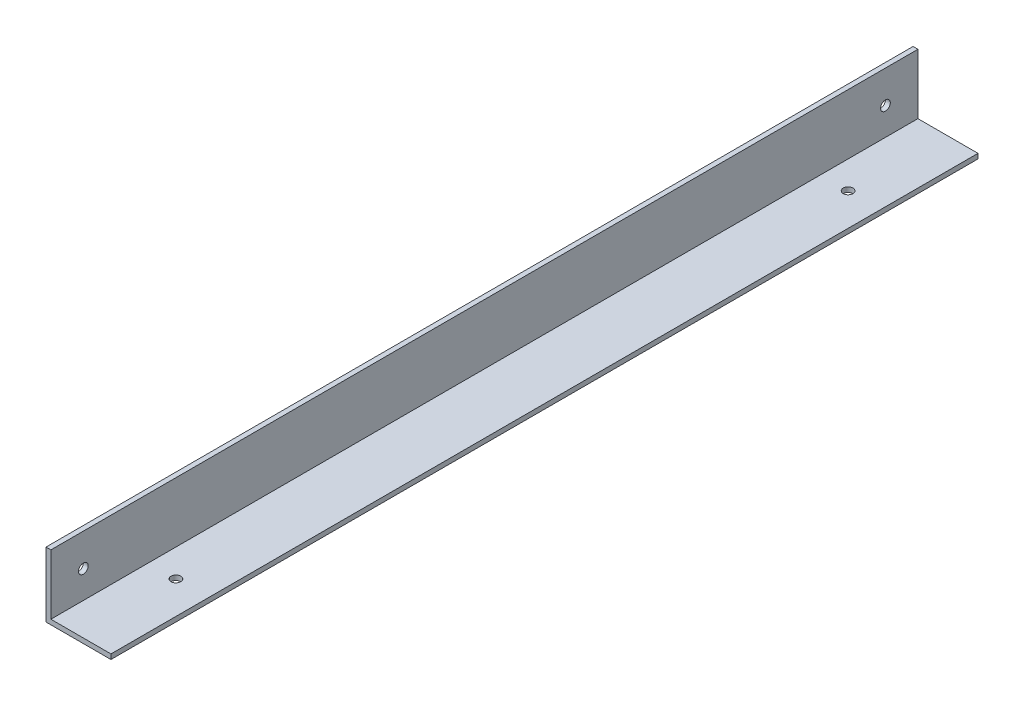
ISO-10303-21;
HEADER;
FILE_DESCRIPTION(('STEP AP214'),'2;1');
FILE_NAME('part.step','',(''),(''),'','','');
FILE_SCHEMA(('AUTOMOTIVE_DESIGN { 1 0 10303 214 1 1 1 1 }'));
ENDSEC;
DATA;
#1=APPLICATION_CONTEXT('core data for automotive mechanical design processes');
#2=APPLICATION_PROTOCOL_DEFINITION('international standard','automotive_design',2000,#1);
#3=PRODUCT_CONTEXT('',#1,'mechanical');
#4=PRODUCT('Part','Part','',(#3));
#5=PRODUCT_RELATED_PRODUCT_CATEGORY('part','',(#4));
#6=PRODUCT_DEFINITION_FORMATION('','',#4);
#7=PRODUCT_DEFINITION_CONTEXT('part definition',#1,'design');
#8=PRODUCT_DEFINITION('design','',#6,#7);
#9=PRODUCT_DEFINITION_SHAPE('','',#8);
#10=(LENGTH_UNIT() NAMED_UNIT(*) SI_UNIT(.MILLI.,.METRE.));
#11=(NAMED_UNIT(*) PLANE_ANGLE_UNIT() SI_UNIT($,.RADIAN.));
#12=(NAMED_UNIT(*) SI_UNIT($,.STERADIAN.) SOLID_ANGLE_UNIT());
#13=UNCERTAINTY_MEASURE_WITH_UNIT(LENGTH_MEASURE(1.E-05),#10,'distance_accuracy_value','');
#14=(GEOMETRIC_REPRESENTATION_CONTEXT(3) GLOBAL_UNCERTAINTY_ASSIGNED_CONTEXT((#13)) GLOBAL_UNIT_ASSIGNED_CONTEXT((#10,
#11,#12)) REPRESENTATION_CONTEXT('',''));
#15=CARTESIAN_POINT('',(0.,0.,0.));
#16=DIRECTION('',(0.,0.,1.));
#17=DIRECTION('',(1.,0.,0.));
#18=AXIS2_PLACEMENT_3D('',#15,#16,#17);
#19=CARTESIAN_POINT('',(0.,20.,267.));
#20=DIRECTION('',(1.,0.,0.));
#21=DIRECTION('',(0.,1.,0.));
#22=AXIS2_PLACEMENT_3D('',#19,#20,#21);
#23=PLANE('',#22);
#24=CARTESIAN_POINT('',(0.,10.,10.));
#25=DIRECTION('',(1.,0.,0.));
#26=DIRECTION('',(0.,1.,0.));
#27=AXIS2_PLACEMENT_3D('',#24,#25,#26);
#28=CIRCLE('',#27,1.5);
#29=CARTESIAN_POINT('',(0.,11.5,10.));
#30=VERTEX_POINT('',#29);
#31=EDGE_CURVE('E160',#30,#30,#28,.T.);
#32=ORIENTED_EDGE('',*,*,#31,.T.);
#33=EDGE_LOOP('',(#32));
#34=FACE_BOUND('',#33,.T.);
#35=CARTESIAN_POINT('',(0.,10.,257.));
#36=DIRECTION('',(1.,0.,0.));
#37=DIRECTION('',(0.,1.,0.));
#38=AXIS2_PLACEMENT_3D('',#35,#36,#37);
#39=CIRCLE('',#38,1.50000000000002);
#40=CARTESIAN_POINT('',(0.,11.5,257.));
#41=VERTEX_POINT('',#40);
#42=EDGE_CURVE('E163',#41,#41,#39,.T.);
#43=ORIENTED_EDGE('',*,*,#42,.T.);
#44=EDGE_LOOP('',(#43));
#45=FACE_BOUND('',#44,.T.);
#46=DIRECTION('',(0.,-1.,0.));
#47=VECTOR('',#46,1.);
#48=CARTESIAN_POINT('',(0.,20.,0.));
#49=LINE('',#48,#47);
#50=CARTESIAN_POINT('',(0.,20.,0.));
#51=VERTEX_POINT('',#50);
#52=CARTESIAN_POINT('',(0.,0.,0.));
#53=VERTEX_POINT('',#52);
#54=EDGE_CURVE('E115',#51,#53,#49,.T.);
#55=ORIENTED_EDGE('',*,*,#54,.T.);
#56=DIRECTION('',(0.,0.,-1.));
#57=VECTOR('',#56,1.);
#58=CARTESIAN_POINT('',(0.,0.,267.));
#59=LINE('',#58,#57);
#60=CARTESIAN_POINT('',(0.,0.,267.));
#61=VERTEX_POINT('',#60);
#62=EDGE_CURVE('E11',#61,#53,#59,.T.);
#63=ORIENTED_EDGE('',*,*,#62,.F.);
#64=DIRECTION('',(0.,-1.,0.));
#65=VECTOR('',#64,1.);
#66=CARTESIAN_POINT('',(0.,20.,267.));
#67=LINE('',#66,#65);
#68=CARTESIAN_POINT('',(0.,20.,267.));
#69=VERTEX_POINT('',#68);
#70=EDGE_CURVE('E126',#69,#61,#67,.T.);
#71=ORIENTED_EDGE('',*,*,#70,.F.);
#72=DIRECTION('',(0.,0.,-1.));
#73=VECTOR('',#72,1.);
#74=CARTESIAN_POINT('',(0.,20.,267.));
#75=LINE('',#74,#73);
#76=EDGE_CURVE('E111',#69,#51,#75,.T.);
#77=ORIENTED_EDGE('',*,*,#76,.T.);
#78=EDGE_LOOP('',(#55,#63,#71,#77));
#79=FACE_BOUND('',#78,.T.);
#80=ADVANCED_FACE('F31',(#34,#45,#79),#23,.F.);
#81=CARTESIAN_POINT('',(0.,0.,267.));
#82=DIRECTION('',(0.,1.,0.));
#83=DIRECTION('',(0.,0.,1.));
#84=AXIS2_PLACEMENT_3D('',#81,#82,#83);
#85=PLANE('',#84);
#86=CARTESIAN_POINT('',(10.,0.,237.));
#87=DIRECTION('',(0.,1.,0.));
#88=DIRECTION('',(-1.,0.,0.));
#89=AXIS2_PLACEMENT_3D('',#86,#87,#88);
#90=CIRCLE('',#89,1.5);
#91=CARTESIAN_POINT('',(8.5,0.,237.));
#92=VERTEX_POINT('',#91);
#93=EDGE_CURVE('E169',#92,#92,#90,.T.);
#94=ORIENTED_EDGE('',*,*,#93,.T.);
#95=EDGE_LOOP('',(#94));
#96=FACE_BOUND('',#95,.T.);
#97=CARTESIAN_POINT('',(10.,0.,30.));
#98=DIRECTION('',(0.,1.,0.));
#99=DIRECTION('',(-1.,0.,0.));
#100=AXIS2_PLACEMENT_3D('',#97,#98,#99);
#101=CIRCLE('',#100,1.5);
#102=CARTESIAN_POINT('',(8.5,0.,30.));
#103=VERTEX_POINT('',#102);
#104=EDGE_CURVE('E119',#103,#103,#101,.T.);
#105=ORIENTED_EDGE('',*,*,#104,.T.);
#106=EDGE_LOOP('',(#105));
#107=FACE_BOUND('',#106,.T.);
#108=DIRECTION('',(1.,0.,0.));
#109=VECTOR('',#108,1.);
#110=CARTESIAN_POINT('',(0.,0.,0.));
#111=LINE('',#110,#109);
#112=CARTESIAN_POINT('',(20.,0.,0.));
#113=VERTEX_POINT('',#112);
#114=EDGE_CURVE('E118',#53,#113,#111,.T.);
#115=ORIENTED_EDGE('',*,*,#114,.T.);
#116=DIRECTION('',(0.,0.,-1.));
#117=VECTOR('',#116,1.);
#118=CARTESIAN_POINT('',(20.,0.,267.));
#119=LINE('',#118,#117);
#120=CARTESIAN_POINT('',(20.,0.,267.));
#121=VERTEX_POINT('',#120);
#122=EDGE_CURVE('E39',#121,#113,#119,.T.);
#123=ORIENTED_EDGE('',*,*,#122,.F.);
#124=DIRECTION('',(1.,0.,0.));
#125=VECTOR('',#124,1.);
#126=CARTESIAN_POINT('',(0.,0.,267.));
#127=LINE('',#126,#125);
#128=EDGE_CURVE('E84',#61,#121,#127,.T.);
#129=ORIENTED_EDGE('',*,*,#128,.F.);
#130=ORIENTED_EDGE('',*,*,#62,.T.);
#131=EDGE_LOOP('',(#115,#123,#129,#130));
#132=FACE_BOUND('',#131,.T.);
#133=ADVANCED_FACE('F151',(#96,#107,#132),#85,.F.);
#134=CARTESIAN_POINT('',(20.,0.,267.));
#135=DIRECTION('',(-1.,0.,0.));
#136=DIRECTION('',(0.,0.,1.));
#137=AXIS2_PLACEMENT_3D('',#134,#135,#136);
#138=PLANE('',#137);
#139=DIRECTION('',(0.,1.,0.));
#140=VECTOR('',#139,1.);
#141=CARTESIAN_POINT('',(20.,0.,0.));
#142=LINE('',#141,#140);
#143=CARTESIAN_POINT('',(20.,1.5,0.));
#144=VERTEX_POINT('',#143);
#145=EDGE_CURVE('E121',#113,#144,#142,.T.);
#146=ORIENTED_EDGE('',*,*,#145,.T.);
#147=DIRECTION('',(0.,0.,-1.));
#148=VECTOR('',#147,1.);
#149=CARTESIAN_POINT('',(20.,1.5,267.));
#150=LINE('',#149,#148);
#151=CARTESIAN_POINT('',(20.,1.5,267.));
#152=VERTEX_POINT('',#151);
#153=EDGE_CURVE('E106',#152,#144,#150,.T.);
#154=ORIENTED_EDGE('',*,*,#153,.F.);
#155=DIRECTION('',(0.,1.,0.));
#156=VECTOR('',#155,1.);
#157=CARTESIAN_POINT('',(20.,0.,267.));
#158=LINE('',#157,#156);
#159=EDGE_CURVE('E97',#121,#152,#158,.T.);
#160=ORIENTED_EDGE('',*,*,#159,.F.);
#161=ORIENTED_EDGE('',*,*,#122,.T.);
#162=EDGE_LOOP('',(#146,#154,#160,#161));
#163=FACE_BOUND('',#162,.T.);
#164=ADVANCED_FACE('F132',(#163),#138,.F.);
#165=CARTESIAN_POINT('',(20.,1.5,267.));
#166=DIRECTION('',(0.,-1.,0.));
#167=DIRECTION('',(1.,0.,0.));
#168=AXIS2_PLACEMENT_3D('',#165,#166,#167);
#169=PLANE('',#168);
#170=CARTESIAN_POINT('',(10.,1.5,237.));
#171=DIRECTION('',(0.,1.,0.));
#172=DIRECTION('',(-1.,0.,0.));
#173=AXIS2_PLACEMENT_3D('',#170,#171,#172);
#174=CIRCLE('',#173,1.5);
#175=CARTESIAN_POINT('',(8.5,1.5,237.));
#176=VERTEX_POINT('',#175);
#177=EDGE_CURVE('E165',#176,#176,#174,.T.);
#178=ORIENTED_EDGE('',*,*,#177,.F.);
#179=EDGE_LOOP('',(#178));
#180=FACE_BOUND('',#179,.T.);
#181=CARTESIAN_POINT('',(10.,1.5,30.));
#182=DIRECTION('',(0.,1.,0.));
#183=DIRECTION('',(-1.,0.,0.));
#184=AXIS2_PLACEMENT_3D('',#181,#182,#183);
#185=CIRCLE('',#184,1.5);
#186=CARTESIAN_POINT('',(8.5,1.5,30.));
#187=VERTEX_POINT('',#186);
#188=EDGE_CURVE('E176',#187,#187,#185,.T.);
#189=ORIENTED_EDGE('',*,*,#188,.F.);
#190=EDGE_LOOP('',(#189));
#191=FACE_BOUND('',#190,.T.);
#192=DIRECTION('',(-1.,0.,0.));
#193=VECTOR('',#192,1.);
#194=CARTESIAN_POINT('',(20.,1.5,0.));
#195=LINE('',#194,#193);
#196=CARTESIAN_POINT('',(1.5,1.5,0.));
#197=VERTEX_POINT('',#196);
#198=EDGE_CURVE('E105',#144,#197,#195,.T.);
#199=ORIENTED_EDGE('',*,*,#198,.T.);
#200=DIRECTION('',(0.,0.,-1.));
#201=VECTOR('',#200,1.);
#202=CARTESIAN_POINT('',(1.5,1.5,267.));
#203=LINE('',#202,#201);
#204=CARTESIAN_POINT('',(1.5,1.5,267.));
#205=VERTEX_POINT('',#204);
#206=EDGE_CURVE('E102',#205,#197,#203,.T.);
#207=ORIENTED_EDGE('',*,*,#206,.F.);
#208=DIRECTION('',(-1.,0.,0.));
#209=VECTOR('',#208,1.);
#210=CARTESIAN_POINT('',(20.,1.5,267.));
#211=LINE('',#210,#209);
#212=EDGE_CURVE('E91',#152,#205,#211,.T.);
#213=ORIENTED_EDGE('',*,*,#212,.F.);
#214=ORIENTED_EDGE('',*,*,#153,.T.);
#215=EDGE_LOOP('',(#199,#207,#213,#214));
#216=FACE_BOUND('',#215,.T.);
#217=ADVANCED_FACE('F103',(#180,#191,#216),#169,.F.);
#218=CARTESIAN_POINT('',(1.5,1.5,267.));
#219=DIRECTION('',(-1.,0.,0.));
#220=DIRECTION('',(0.,-1.,0.));
#221=AXIS2_PLACEMENT_3D('',#218,#219,#220);
#222=PLANE('',#221);
#223=CARTESIAN_POINT('',(1.5,10.,10.));
#224=DIRECTION('',(1.,0.,0.));
#225=DIRECTION('',(0.,1.,0.));
#226=AXIS2_PLACEMENT_3D('',#223,#224,#225);
#227=CIRCLE('',#226,1.5);
#228=CARTESIAN_POINT('',(1.5,11.5,10.));
#229=VERTEX_POINT('',#228);
#230=EDGE_CURVE('E261',#229,#229,#227,.T.);
#231=ORIENTED_EDGE('',*,*,#230,.F.);
#232=EDGE_LOOP('',(#231));
#233=FACE_BOUND('',#232,.T.);
#234=CARTESIAN_POINT('',(1.5,10.,257.));
#235=DIRECTION('',(1.,0.,0.));
#236=DIRECTION('',(0.,1.,0.));
#237=AXIS2_PLACEMENT_3D('',#234,#235,#236);
#238=CIRCLE('',#237,1.50000000000002);
#239=CARTESIAN_POINT('',(1.5,11.5,257.));
#240=VERTEX_POINT('',#239);
#241=EDGE_CURVE('E166',#240,#240,#238,.T.);
#242=ORIENTED_EDGE('',*,*,#241,.F.);
#243=EDGE_LOOP('',(#242));
#244=FACE_BOUND('',#243,.T.);
#245=DIRECTION('',(0.,1.,0.));
#246=VECTOR('',#245,1.);
#247=CARTESIAN_POINT('',(1.5,1.5,0.));
#248=LINE('',#247,#246);
#249=CARTESIAN_POINT('',(1.5,20.,0.));
#250=VERTEX_POINT('',#249);
#251=EDGE_CURVE('E70',#197,#250,#248,.T.);
#252=ORIENTED_EDGE('',*,*,#251,.T.);
#253=DIRECTION('',(0.,0.,-1.));
#254=VECTOR('',#253,1.);
#255=CARTESIAN_POINT('',(1.5,20.,267.));
#256=LINE('',#255,#254);
#257=CARTESIAN_POINT('',(1.5,20.,267.));
#258=VERTEX_POINT('',#257);
#259=EDGE_CURVE('E107',#258,#250,#256,.T.);
#260=ORIENTED_EDGE('',*,*,#259,.F.);
#261=DIRECTION('',(0.,1.,0.));
#262=VECTOR('',#261,1.);
#263=CARTESIAN_POINT('',(1.5,1.5,267.));
#264=LINE('',#263,#262);
#265=EDGE_CURVE('E95',#205,#258,#264,.T.);
#266=ORIENTED_EDGE('',*,*,#265,.F.);
#267=ORIENTED_EDGE('',*,*,#206,.T.);
#268=EDGE_LOOP('',(#252,#260,#266,#267));
#269=FACE_BOUND('',#268,.T.);
#270=ADVANCED_FACE('F109',(#233,#244,#269),#222,.F.);
#271=CARTESIAN_POINT('',(1.5,20.,267.));
#272=DIRECTION('',(0.,-1.,0.));
#273=DIRECTION('',(0.,0.,-1.));
#274=AXIS2_PLACEMENT_3D('',#271,#272,#273);
#275=PLANE('',#274);
#276=DIRECTION('',(-1.,0.,0.));
#277=VECTOR('',#276,1.);
#278=CARTESIAN_POINT('',(1.5,20.,0.));
#279=LINE('',#278,#277);
#280=EDGE_CURVE('E76',#250,#51,#279,.T.);
#281=ORIENTED_EDGE('',*,*,#280,.T.);
#282=ORIENTED_EDGE('',*,*,#76,.F.);
#283=DIRECTION('',(-1.,0.,0.));
#284=VECTOR('',#283,1.);
#285=CARTESIAN_POINT('',(1.5,20.,267.));
#286=LINE('',#285,#284);
#287=EDGE_CURVE('E47',#258,#69,#286,.T.);
#288=ORIENTED_EDGE('',*,*,#287,.F.);
#289=ORIENTED_EDGE('',*,*,#259,.T.);
#290=EDGE_LOOP('',(#281,#282,#288,#289));
#291=FACE_BOUND('',#290,.T.);
#292=ADVANCED_FACE('F139',(#291),#275,.F.);
#293=CARTESIAN_POINT('',(0.,0.,267.));
#294=DIRECTION('',(0.,0.,1.));
#295=DIRECTION('',(1.,0.,0.));
#296=AXIS2_PLACEMENT_3D('',#293,#294,#295);
#297=PLANE('',#296);
#298=ORIENTED_EDGE('',*,*,#70,.T.);
#299=ORIENTED_EDGE('',*,*,#128,.T.);
#300=ORIENTED_EDGE('',*,*,#159,.T.);
#301=ORIENTED_EDGE('',*,*,#212,.T.);
#302=ORIENTED_EDGE('',*,*,#265,.T.);
#303=ORIENTED_EDGE('',*,*,#287,.T.);
#304=EDGE_LOOP('',(#298,#299,#300,#301,#302,#303));
#305=FACE_BOUND('',#304,.T.);
#306=ADVANCED_FACE('F93',(#305),#297,.T.);
#307=CARTESIAN_POINT('',(0.,0.,0.));
#308=DIRECTION('',(0.,0.,1.));
#309=DIRECTION('',(1.,0.,0.));
#310=AXIS2_PLACEMENT_3D('',#307,#308,#309);
#311=PLANE('',#310);
#312=ORIENTED_EDGE('',*,*,#54,.F.);
#313=ORIENTED_EDGE('',*,*,#280,.F.);
#314=ORIENTED_EDGE('',*,*,#251,.F.);
#315=ORIENTED_EDGE('',*,*,#198,.F.);
#316=ORIENTED_EDGE('',*,*,#145,.F.);
#317=ORIENTED_EDGE('',*,*,#114,.F.);
#318=EDGE_LOOP('',(#312,#313,#314,#315,#316,#317));
#319=FACE_BOUND('',#318,.T.);
#320=ADVANCED_FACE('F135',(#319),#311,.F.);
#321=CARTESIAN_POINT('',(10.,0.,30.));
#322=DIRECTION('',(0.,1.,0.));
#323=DIRECTION('',(-1.,0.,0.));
#324=AXIS2_PLACEMENT_3D('',#321,#322,#323);
#325=CYLINDRICAL_SURFACE('',#324,1.5);
#326=ORIENTED_EDGE('',*,*,#104,.F.);
#327=EDGE_LOOP('',(#326));
#328=FACE_BOUND('',#327,.T.);
#329=ORIENTED_EDGE('',*,*,#188,.T.);
#330=EDGE_LOOP('',(#329));
#331=FACE_BOUND('',#330,.T.);
#332=ADVANCED_FACE('F185',(#328,#331),#325,.F.);
#333=CARTESIAN_POINT('',(10.,0.,237.));
#334=DIRECTION('',(0.,1.,0.));
#335=DIRECTION('',(-1.,0.,0.));
#336=AXIS2_PLACEMENT_3D('',#333,#334,#335);
#337=CYLINDRICAL_SURFACE('',#336,1.5);
#338=ORIENTED_EDGE('',*,*,#93,.F.);
#339=EDGE_LOOP('',(#338));
#340=FACE_BOUND('',#339,.T.);
#341=ORIENTED_EDGE('',*,*,#177,.T.);
#342=EDGE_LOOP('',(#341));
#343=FACE_BOUND('',#342,.T.);
#344=ADVANCED_FACE('F196',(#340,#343),#337,.F.);
#345=CARTESIAN_POINT('',(-262.5,9.99999999999998,257.));
#346=DIRECTION('',(1.,0.,0.));
#347=DIRECTION('',(0.,1.,0.));
#348=AXIS2_PLACEMENT_3D('',#345,#346,#347);
#349=CYLINDRICAL_SURFACE('',#348,1.50000000000002);
#350=ORIENTED_EDGE('',*,*,#241,.T.);
#351=EDGE_LOOP('',(#350));
#352=FACE_BOUND('',#351,.T.);
#353=ORIENTED_EDGE('',*,*,#42,.F.);
#354=EDGE_LOOP('',(#353));
#355=FACE_BOUND('',#354,.T.);
#356=ADVANCED_FACE('F198',(#352,#355),#349,.F.);
#357=CARTESIAN_POINT('',(-262.5,9.99999999999998,10.));
#358=DIRECTION('',(1.,0.,0.));
#359=DIRECTION('',(0.,1.,0.));
#360=AXIS2_PLACEMENT_3D('',#357,#358,#359);
#361=CYLINDRICAL_SURFACE('',#360,1.5);
#362=ORIENTED_EDGE('',*,*,#230,.T.);
#363=EDGE_LOOP('',(#362));
#364=FACE_BOUND('',#363,.T.);
#365=ORIENTED_EDGE('',*,*,#31,.F.);
#366=EDGE_LOOP('',(#365));
#367=FACE_BOUND('',#366,.T.);
#368=ADVANCED_FACE('F205',(#364,#367),#361,.F.);
#369=CLOSED_SHELL('',(#80,#133,#164,#217,#270,#292,#306,#320,#332,#344,#356,#368));
#370=MANIFOLD_SOLID_BREP('B2',#369);
#371=ADVANCED_BREP_SHAPE_REPRESENTATION('',(#18,#370),#14);
#372=SHAPE_DEFINITION_REPRESENTATION(#9,#371);
ENDSEC;
END-ISO-10303-21;
